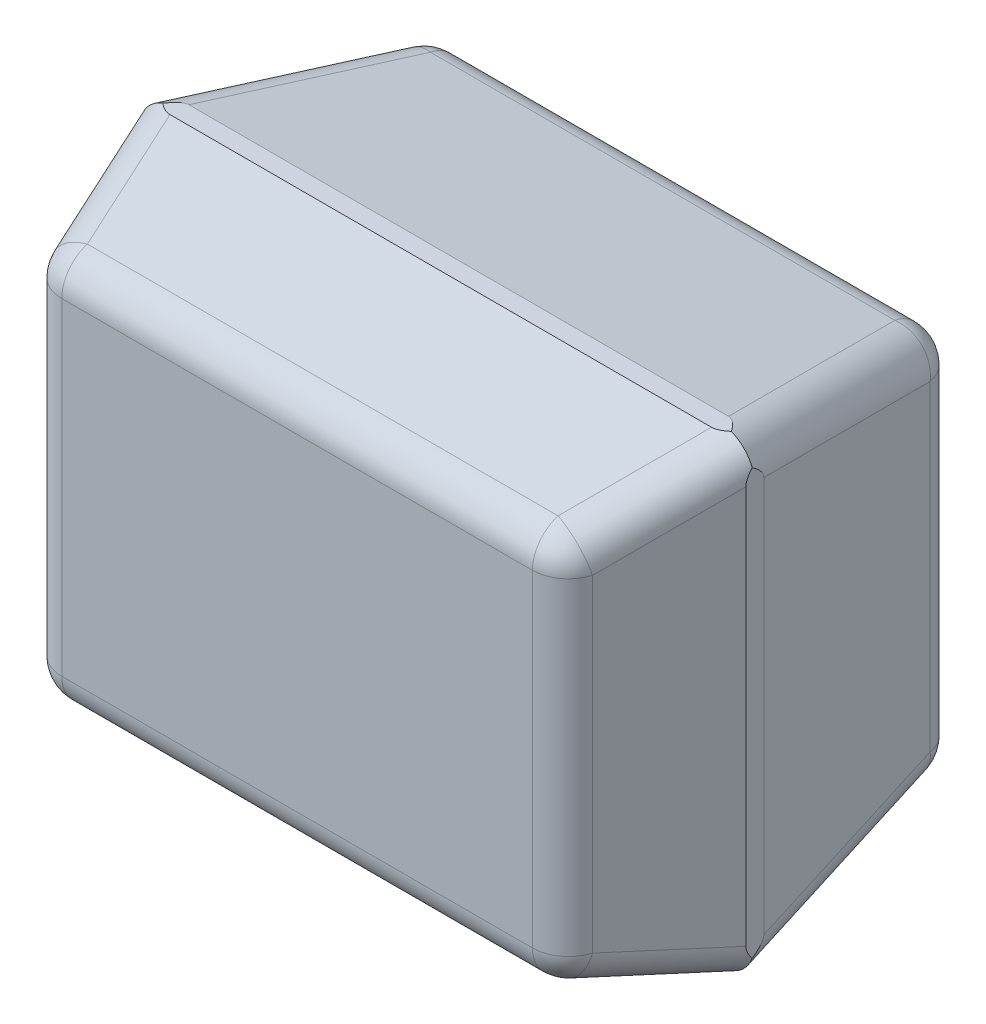
ISO-10303-21;
HEADER;
FILE_DESCRIPTION(('STEP AP214'),'2;1');
FILE_NAME('part.step','',(''),(''),'','','');
FILE_SCHEMA(('AUTOMOTIVE_DESIGN { 1 0 10303 214 1 1 1 1 }'));
ENDSEC;
DATA;
#1=APPLICATION_CONTEXT('core data for automotive mechanical design processes');
#2=APPLICATION_PROTOCOL_DEFINITION('international standard','automotive_design',2000,#1);
#3=PRODUCT_CONTEXT('',#1,'mechanical');
#4=PRODUCT('Part','Part','',(#3));
#5=PRODUCT_RELATED_PRODUCT_CATEGORY('part','',(#4));
#6=PRODUCT_DEFINITION_FORMATION('','',#4);
#7=PRODUCT_DEFINITION_CONTEXT('part definition',#1,'design');
#8=PRODUCT_DEFINITION('design','',#6,#7);
#9=PRODUCT_DEFINITION_SHAPE('','',#8);
#10=(LENGTH_UNIT() NAMED_UNIT(*) SI_UNIT(.MILLI.,.METRE.));
#11=(NAMED_UNIT(*) PLANE_ANGLE_UNIT() SI_UNIT($,.RADIAN.));
#12=(NAMED_UNIT(*) SI_UNIT($,.STERADIAN.) SOLID_ANGLE_UNIT());
#13=UNCERTAINTY_MEASURE_WITH_UNIT(LENGTH_MEASURE(1.E-05),#10,'distance_accuracy_value','');
#14=(GEOMETRIC_REPRESENTATION_CONTEXT(3) GLOBAL_UNCERTAINTY_ASSIGNED_CONTEXT((#13)) GLOBAL_UNIT_ASSIGNED_CONTEXT((#10,
#11,#12)) REPRESENTATION_CONTEXT('',''));
#15=CARTESIAN_POINT('',(0.,0.,0.));
#16=DIRECTION('',(0.,0.,1.));
#17=DIRECTION('',(1.,0.,0.));
#18=AXIS2_PLACEMENT_3D('',#15,#16,#17);
#19=CARTESIAN_POINT('',(0.85,-0.65,0.));
#20=DIRECTION('',(1.,0.,0.));
#21=DIRECTION('',(0.,1.,0.));
#22=AXIS2_PLACEMENT_3D('',#19,#20,#21);
#23=PLANE('',#22);
#24=CARTESIAN_POINT('',(0.85,0.65,1.200820095655));
#25=DIRECTION('',(-1.,0.,0.));
#26=DIRECTION('',(0.,-0.181547479456044,-0.983382180387238));
#27=AXIS2_PLACEMENT_3D('',#24,#25,#26);
#28=ELLIPSE('',#27,0.559823881036,0.1);
#29=CARTESIAN_POINT('',(0.85,0.591767771434,0.682368669292));
#30=VERTEX_POINT('',#29);
#31=CARTESIAN_POINT('',(0.85,0.551661781961,0.65));
#32=VERTEX_POINT('',#31);
#33=EDGE_CURVE('E279',#30,#32,#28,.T.);
#34=ORIENTED_EDGE('',*,*,#33,.F.);
#35=CARTESIAN_POINT('',(0.85,0.65,0.351989783036));
#36=DIRECTION('',(-1.,0.,0.));
#37=DIRECTION('',(0.,-0.28734788556607,0.957826285221234));
#38=AXIS2_PLACEMENT_3D('',#35,#36,#37);
#39=ELLIPSE('',#38,0.36209268304,0.1);
#40=CARTESIAN_POINT('',(0.85,0.554217371478,0.7));
#41=VERTEX_POINT('',#40);
#42=EDGE_CURVE('E395',#41,#30,#39,.T.);
#43=ORIENTED_EDGE('',*,*,#42,.F.);
#44=DIRECTION('',(0.,1.,0.));
#45=VECTOR('',#44,1.);
#46=CARTESIAN_POINT('',(0.85,-0.325,0.7));
#47=LINE('',#46,#45);
#48=CARTESIAN_POINT('',(0.85,-0.554217371478,0.7));
#49=VERTEX_POINT('',#48);
#50=EDGE_CURVE('E11',#49,#41,#47,.T.);
#51=ORIENTED_EDGE('',*,*,#50,.F.);
#52=CARTESIAN_POINT('',(0.85,-0.65,0.351989783036));
#53=DIRECTION('',(-1.,0.,0.));
#54=DIRECTION('',(0.,0.28734788556607,0.957826285221234));
#55=AXIS2_PLACEMENT_3D('',#52,#53,#54);
#56=ELLIPSE('',#55,0.36209268304,0.1);
#57=CARTESIAN_POINT('',(0.85,-0.591767771434,0.682368669292));
#58=VERTEX_POINT('',#57);
#59=EDGE_CURVE('E465',#58,#49,#56,.T.);
#60=ORIENTED_EDGE('',*,*,#59,.F.);
#61=CARTESIAN_POINT('',(0.85,-0.65,1.200820095655));
#62=DIRECTION('',(-1.,0.,0.));
#63=DIRECTION('',(0.,0.181547479456044,-0.983382180387238));
#64=AXIS2_PLACEMENT_3D('',#61,#62,#63);
#65=ELLIPSE('',#64,0.559823881036,0.1);
#66=CARTESIAN_POINT('',(0.85,-0.551661781961,0.65));
#67=VERTEX_POINT('',#66);
#68=EDGE_CURVE('E365',#67,#58,#65,.T.);
#69=ORIENTED_EDGE('',*,*,#68,.F.);
#70=DIRECTION('',(0.,-1.,0.));
#71=VECTOR('',#70,1.);
#72=CARTESIAN_POINT('',(0.85,-0.325,0.65));
#73=LINE('',#72,#71);
#74=EDGE_CURVE('E27',#32,#67,#73,.T.);
#75=ORIENTED_EDGE('',*,*,#74,.F.);
#76=EDGE_LOOP('',(#34,#43,#51,#60,#69,#75));
#77=FACE_BOUND('',#76,.T.);
#78=ADVANCED_FACE('F16',(#77),#23,.T.);
#79=CARTESIAN_POINT('',(0.425,0.59,0.9));
#80=DIRECTION('',(0.,0.957826285221234,0.28734788556607));
#81=DIRECTION('',(1.,0.,0.));
#82=AXIS2_PLACEMENT_3D('',#79,#80,#81);
#83=PLANE('',#82);
#84=DIRECTION('',(-0.276172385369158,-0.276172385369158,0.920574617898527));
#85=VECTOR('',#84,1.);
#86=CARTESIAN_POINT('',(0.652709266874,0.548491895396,1.038360348681));
#87=LINE('',#86,#85);
#88=CARTESIAN_POINT('',(0.754217371478,0.65,0.7));
#89=VERTEX_POINT('',#88);
#90=CARTESIAN_POINT('',(0.655596934911,0.551379563433,1.028734788557));
#91=VERTEX_POINT('',#90);
#92=EDGE_CURVE('E300',#89,#91,#87,.T.);
#93=ORIENTED_EDGE('',*,*,#92,.F.);
#94=DIRECTION('',(-1.,0.,0.));
#95=VECTOR('',#94,1.);
#96=CARTESIAN_POINT('',(0.425,0.65,0.7));
#97=LINE('',#96,#95);
#98=CARTESIAN_POINT('',(-0.754217371478,0.65,0.7));
#99=VERTEX_POINT('',#98);
#100=EDGE_CURVE('E328',#89,#99,#97,.T.);
#101=ORIENTED_EDGE('',*,*,#100,.T.);
#102=DIRECTION('',(-0.276172385369158,0.276172385369158,-0.920574617898527));
#103=VECTOR('',#102,1.);
#104=CARTESIAN_POINT('',(-0.64508214823,0.540864776752,1.063784077494));
#105=LINE('',#104,#103);
#106=CARTESIAN_POINT('',(-0.655596934911,0.551379563433,1.028734788557));
#107=VERTEX_POINT('',#106);
#108=EDGE_CURVE('E400',#107,#99,#105,.T.);
#109=ORIENTED_EDGE('',*,*,#108,.F.);
#110=DIRECTION('',(-1.,0.,0.));
#111=VECTOR('',#110,1.);
#112=CARTESIAN_POINT('',(0.2125,0.551379563433,1.028734788557));
#113=LINE('',#112,#111);
#114=EDGE_CURVE('E285',#91,#107,#113,.T.);
#115=ORIENTED_EDGE('',*,*,#114,.F.);
#116=EDGE_LOOP('',(#93,#101,#109,#115));
#117=FACE_BOUND('',#116,.T.);
#118=ADVANCED_FACE('F871',(#117),#83,.T.);
#119=CARTESIAN_POINT('',(0.79,-0.325,0.9));
#120=DIRECTION('',(0.957826285221234,0.,0.28734788556607));
#121=DIRECTION('',(0.,-1.,0.));
#122=AXIS2_PLACEMENT_3D('',#119,#120,#121);
#123=PLANE('',#122);
#124=DIRECTION('',(-0.276172385369158,0.276172385369158,0.920574617898527));
#125=VECTOR('',#124,1.);
#126=CARTESIAN_POINT('',(0.740864776752,-0.44508214823,1.063784077494));
#127=LINE('',#126,#125);
#128=CARTESIAN_POINT('',(0.751379563433,-0.455596934911,1.028734788557));
#129=VERTEX_POINT('',#128);
#130=EDGE_CURVE('E460',#49,#129,#127,.T.);
#131=ORIENTED_EDGE('',*,*,#130,.F.);
#132=ORIENTED_EDGE('',*,*,#50,.T.);
#133=DIRECTION('',(0.276172385369158,0.276172385369158,-0.920574617898527));
#134=VECTOR('',#133,1.);
#135=CARTESIAN_POINT('',(0.748491895396,0.452709266874,1.038360348681));
#136=LINE('',#135,#134);
#137=CARTESIAN_POINT('',(0.751379563433,0.455596934911,1.028734788557));
#138=VERTEX_POINT('',#137);
#139=EDGE_CURVE('E356',#138,#41,#136,.T.);
#140=ORIENTED_EDGE('',*,*,#139,.F.);
#141=DIRECTION('',(0.,1.,0.));
#142=VECTOR('',#141,1.);
#143=CARTESIAN_POINT('',(0.751379563433,-0.1625,1.028734788557));
#144=LINE('',#143,#142);
#145=EDGE_CURVE('E313',#129,#138,#144,.T.);
#146=ORIENTED_EDGE('',*,*,#145,.F.);
#147=EDGE_LOOP('',(#131,#132,#140,#146));
#148=FACE_BOUND('',#147,.T.);
#149=ADVANCED_FACE('F876',(#148),#123,.T.);
#150=CARTESIAN_POINT('',(0.79,-0.325,0.325));
#151=DIRECTION('',(0.983382180387238,0.,-0.181547479456044));
#152=DIRECTION('',(0.,-1.,0.));
#153=AXIS2_PLACEMENT_3D('',#150,#151,#152);
#154=PLANE('',#153);
#155=DIRECTION('',(-0.178627606623071,-0.178627606623071,-0.967566202543385));
#156=VECTOR('',#155,1.);
#157=CARTESIAN_POINT('',(0.772716752359,0.474378534321,0.231382408613));
#158=LINE('',#157,#156);
#159=CARTESIAN_POINT('',(0.745109892687,0.446771674648,0.08184525205439));
#160=VERTEX_POINT('',#159);
#161=EDGE_CURVE('E248',#32,#160,#158,.T.);
#162=ORIENTED_EDGE('',*,*,#161,.F.);
#163=ORIENTED_EDGE('',*,*,#74,.T.);
#164=DIRECTION('',(0.178627606623071,-0.178627606623071,0.967566202543385));
#165=VECTOR('',#164,1.);
#166=CARTESIAN_POINT('',(0.769525970175,-0.471187752136,0.214099005112));
#167=LINE('',#166,#165);
#168=CARTESIAN_POINT('',(0.745109892687,-0.446771674648,0.08184525205439));
#169=VERTEX_POINT('',#168);
#170=EDGE_CURVE('E361',#169,#67,#167,.T.);
#171=ORIENTED_EDGE('',*,*,#170,.F.);
#172=DIRECTION('',(0.,-1.,0.));
#173=VECTOR('',#172,1.);
#174=CARTESIAN_POINT('',(0.745109892687,-0.1625,0.08184525205439));
#175=LINE('',#174,#173);
#176=EDGE_CURVE('E335',#160,#169,#175,.T.);
#177=ORIENTED_EDGE('',*,*,#176,.F.);
#178=EDGE_LOOP('',(#162,#163,#171,#177));
#179=FACE_BOUND('',#178,.T.);
#180=ADVANCED_FACE('F606',(#179),#154,.T.);
#181=CARTESIAN_POINT('',(0.,0.,1.1));
#182=DIRECTION('',(0.,0.,1.));
#183=DIRECTION('',(1.,0.,0.));
#184=AXIS2_PLACEMENT_3D('',#181,#182,#183);
#185=PLANE('',#184);
#186=DIRECTION('',(1.,0.,0.));
#187=VECTOR('',#186,1.);
#188=CARTESIAN_POINT('',(0.2125,0.455596934911,1.1));
#189=LINE('',#188,#187);
#190=CARTESIAN_POINT('',(-0.655596934911,0.455596934911,1.1));
#191=VERTEX_POINT('',#190);
#192=CARTESIAN_POINT('',(0.655596934911,0.455596934911,1.1));
#193=VERTEX_POINT('',#192);
#194=EDGE_CURVE('E280',#191,#193,#189,.T.);
#195=ORIENTED_EDGE('',*,*,#194,.F.);
#196=DIRECTION('',(0.,1.,0.));
#197=VECTOR('',#196,1.);
#198=CARTESIAN_POINT('',(-0.655596934911,0.1625,1.1));
#199=LINE('',#198,#197);
#200=CARTESIAN_POINT('',(-0.655596934911,-0.455596934911,1.1));
#201=VERTEX_POINT('',#200);
#202=EDGE_CURVE('E309',#201,#191,#199,.T.);
#203=ORIENTED_EDGE('',*,*,#202,.F.);
#204=DIRECTION('',(-1.,0.,0.));
#205=VECTOR('',#204,1.);
#206=CARTESIAN_POINT('',(-0.2125,-0.455596934911,1.1));
#207=LINE('',#206,#205);
#208=CARTESIAN_POINT('',(0.655596934911,-0.455596934911,1.1));
#209=VERTEX_POINT('',#208);
#210=EDGE_CURVE('E473',#209,#201,#207,.T.);
#211=ORIENTED_EDGE('',*,*,#210,.F.);
#212=DIRECTION('',(0.,-1.,0.));
#213=VECTOR('',#212,1.);
#214=CARTESIAN_POINT('',(0.655596934911,-0.1625,1.1));
#215=LINE('',#214,#213);
#216=EDGE_CURVE('E311',#193,#209,#215,.T.);
#217=ORIENTED_EDGE('',*,*,#216,.F.);
#218=EDGE_LOOP('',(#195,#203,#211,#217));
#219=FACE_BOUND('',#218,.T.);
#220=ADVANCED_FACE('F839',(#219),#185,.T.);
#221=CARTESIAN_POINT('',(-0.79,0.325,0.9));
#222=DIRECTION('',(-0.957826285221234,0.,0.28734788556607));
#223=DIRECTION('',(0.,1.,0.));
#224=AXIS2_PLACEMENT_3D('',#221,#222,#223);
#225=PLANE('',#224);
#226=DIRECTION('',(-0.276172385369158,-0.276172385369158,-0.920574617898527));
#227=VECTOR('',#226,1.);
#228=CARTESIAN_POINT('',(-0.748491895396,-0.452709266874,1.038360348681));
#229=LINE('',#228,#227);
#230=CARTESIAN_POINT('',(-0.751379563433,-0.455596934911,1.028734788557));
#231=VERTEX_POINT('',#230);
#232=CARTESIAN_POINT('',(-0.85,-0.554217371478,0.7));
#233=VERTEX_POINT('',#232);
#234=EDGE_CURVE('E343',#231,#233,#229,.T.);
#235=ORIENTED_EDGE('',*,*,#234,.F.);
#236=DIRECTION('',(0.,-1.,0.));
#237=VECTOR('',#236,1.);
#238=CARTESIAN_POINT('',(-0.751379563433,0.1625,1.028734788557));
#239=LINE('',#238,#237);
#240=CARTESIAN_POINT('',(-0.751379563433,0.455596934911,1.028734788557));
#241=VERTEX_POINT('',#240);
#242=EDGE_CURVE('E305',#241,#231,#239,.T.);
#243=ORIENTED_EDGE('',*,*,#242,.F.);
#244=DIRECTION('',(0.276172385369158,-0.276172385369158,0.920574617898527));
#245=VECTOR('',#244,1.);
#246=CARTESIAN_POINT('',(-0.740864776752,0.44508214823,1.063784077494));
#247=LINE('',#246,#245);
#248=CARTESIAN_POINT('',(-0.85,0.554217371478,0.7));
#249=VERTEX_POINT('',#248);
#250=EDGE_CURVE('E333',#249,#241,#247,.T.);
#251=ORIENTED_EDGE('',*,*,#250,.F.);
#252=DIRECTION('',(0.,-1.,0.));
#253=VECTOR('',#252,1.);
#254=CARTESIAN_POINT('',(-0.85,0.325,0.7));
#255=LINE('',#254,#253);
#256=EDGE_CURVE('E490',#249,#233,#255,.T.);
#257=ORIENTED_EDGE('',*,*,#256,.T.);
#258=EDGE_LOOP('',(#235,#243,#251,#257));
#259=FACE_BOUND('',#258,.T.);
#260=ADVANCED_FACE('F572',(#259),#225,.T.);
#261=CARTESIAN_POINT('',(-0.425,-0.59,0.325));
#262=DIRECTION('',(0.,-0.983382180387238,-0.181547479456044));
#263=DIRECTION('',(0.,0.181547479456044,-0.983382180387238));
#264=AXIS2_PLACEMENT_3D('',#261,#262,#263);
#265=PLANE('',#264);
#266=DIRECTION('',(-0.178627606623071,0.178627606623071,-0.967566202543385));
#267=VECTOR('',#266,1.);
#268=CARTESIAN_POINT('',(0.671187752136,-0.569525970175,0.214099005112));
#269=LINE('',#268,#267);
#270=CARTESIAN_POINT('',(0.751661781961,-0.65,0.65));
#271=VERTEX_POINT('',#270);
#272=CARTESIAN_POINT('',(0.646771674648,-0.545109892687,0.08184525205439));
#273=VERTEX_POINT('',#272);
#274=EDGE_CURVE('E366',#271,#273,#269,.T.);
#275=ORIENTED_EDGE('',*,*,#274,.F.);
#276=DIRECTION('',(-1.,0.,0.));
#277=VECTOR('',#276,1.);
#278=CARTESIAN_POINT('',(-0.425,-0.65,0.65));
#279=LINE('',#278,#277);
#280=CARTESIAN_POINT('',(-0.751661781961,-0.65,0.65));
#281=VERTEX_POINT('',#280);
#282=EDGE_CURVE('E442',#271,#281,#279,.T.);
#283=ORIENTED_EDGE('',*,*,#282,.T.);
#284=DIRECTION('',(-0.178627606623071,-0.178627606623071,0.967566202543385));
#285=VECTOR('',#284,1.);
#286=CARTESIAN_POINT('',(-0.674378534321,-0.572716752359,0.231382408613));
#287=LINE('',#286,#285);
#288=CARTESIAN_POINT('',(-0.646771674648,-0.545109892687,0.08184525205439));
#289=VERTEX_POINT('',#288);
#290=EDGE_CURVE('E291',#289,#281,#287,.T.);
#291=ORIENTED_EDGE('',*,*,#290,.F.);
#292=DIRECTION('',(-1.,0.,0.));
#293=VECTOR('',#292,1.);
#294=CARTESIAN_POINT('',(-0.2125,-0.545109892687,0.08184525205439));
#295=LINE('',#294,#293);
#296=EDGE_CURVE('E315',#273,#289,#295,.T.);
#297=ORIENTED_EDGE('',*,*,#296,.F.);
#298=EDGE_LOOP('',(#275,#283,#291,#297));
#299=FACE_BOUND('',#298,.T.);
#300=ADVANCED_FACE('F815',(#299),#265,.T.);
#301=CARTESIAN_POINT('',(-0.85,-0.65,0.));
#302=DIRECTION('',(0.,-1.,0.));
#303=DIRECTION('',(0.,0.,-1.));
#304=AXIS2_PLACEMENT_3D('',#301,#302,#303);
#305=PLANE('',#304);
#306=CARTESIAN_POINT('',(0.85,-0.65,1.200820095655));
#307=DIRECTION('',(0.,1.,0.));
#308=DIRECTION('',(-0.181547479456044,0.,-0.983382180387238));
#309=AXIS2_PLACEMENT_3D('',#306,#307,#308);
#310=ELLIPSE('',#309,0.559823881036,0.1);
#311=CARTESIAN_POINT('',(0.791767771434,-0.65,0.682368669292));
#312=VERTEX_POINT('',#311);
#313=EDGE_CURVE('E391',#312,#271,#310,.T.);
#314=ORIENTED_EDGE('',*,*,#313,.F.);
#315=CARTESIAN_POINT('',(0.85,-0.65,0.351989783036));
#316=DIRECTION('',(0.,1.,0.));
#317=DIRECTION('',(-0.28734788556607,0.,0.957826285221234));
#318=AXIS2_PLACEMENT_3D('',#315,#316,#317);
#319=ELLIPSE('',#318,0.36209268304,0.1);
#320=CARTESIAN_POINT('',(0.754217371478,-0.65,0.7));
#321=VERTEX_POINT('',#320);
#322=EDGE_CURVE('E439',#321,#312,#319,.T.);
#323=ORIENTED_EDGE('',*,*,#322,.F.);
#324=DIRECTION('',(1.,0.,0.));
#325=VECTOR('',#324,1.);
#326=CARTESIAN_POINT('',(-0.425,-0.65,0.7));
#327=LINE('',#326,#325);
#328=CARTESIAN_POINT('',(-0.754217371478,-0.65,0.7));
#329=VERTEX_POINT('',#328);
#330=EDGE_CURVE('E41',#329,#321,#327,.T.);
#331=ORIENTED_EDGE('',*,*,#330,.F.);
#332=CARTESIAN_POINT('',(-0.85,-0.65,0.351989783036));
#333=DIRECTION('',(0.,1.,0.));
#334=DIRECTION('',(0.28734788556607,0.,0.957826285221234));
#335=AXIS2_PLACEMENT_3D('',#332,#333,#334);
#336=ELLIPSE('',#335,0.36209268304,0.1);
#337=CARTESIAN_POINT('',(-0.791767771434,-0.65,0.682368669292));
#338=VERTEX_POINT('',#337);
#339=EDGE_CURVE('E494',#338,#329,#336,.T.);
#340=ORIENTED_EDGE('',*,*,#339,.F.);
#341=CARTESIAN_POINT('',(-0.85,-0.65,1.200820095655));
#342=DIRECTION('',(0.,1.,0.));
#343=DIRECTION('',(0.181547479456044,0.,-0.983382180387238));
#344=AXIS2_PLACEMENT_3D('',#341,#342,#343);
#345=ELLIPSE('',#344,0.559823881036,0.1);
#346=EDGE_CURVE('E286',#281,#338,#345,.T.);
#347=ORIENTED_EDGE('',*,*,#346,.F.);
#348=ORIENTED_EDGE('',*,*,#282,.F.);
#349=EDGE_LOOP('',(#314,#323,#331,#340,#347,#348));
#350=FACE_BOUND('',#349,.T.);
#351=ADVANCED_FACE('F820',(#350),#305,.T.);
#352=CARTESIAN_POINT('',(-0.425,-0.59,0.9));
#353=DIRECTION('',(0.,-0.957826285221234,0.28734788556607));
#354=DIRECTION('',(-1.,0.,0.));
#355=AXIS2_PLACEMENT_3D('',#352,#353,#354);
#356=PLANE('',#355);
#357=DIRECTION('',(0.276172385369158,-0.276172385369158,-0.920574617898527));
#358=VECTOR('',#357,1.);
#359=CARTESIAN_POINT('',(0.64508214823,-0.540864776752,1.063784077494));
#360=LINE('',#359,#358);
#361=CARTESIAN_POINT('',(0.655596934911,-0.551379563433,1.028734788557));
#362=VERTEX_POINT('',#361);
#363=EDGE_CURVE('E464',#362,#321,#360,.T.);
#364=ORIENTED_EDGE('',*,*,#363,.F.);
#365=DIRECTION('',(1.,0.,0.));
#366=VECTOR('',#365,1.);
#367=CARTESIAN_POINT('',(-0.2125,-0.551379563433,1.028734788557));
#368=LINE('',#367,#366);
#369=CARTESIAN_POINT('',(-0.655596934911,-0.551379563433,1.028734788557));
#370=VERTEX_POINT('',#369);
#371=EDGE_CURVE('E378',#370,#362,#368,.T.);
#372=ORIENTED_EDGE('',*,*,#371,.F.);
#373=DIRECTION('',(0.276172385369158,0.276172385369158,0.920574617898527));
#374=VECTOR('',#373,1.);
#375=CARTESIAN_POINT('',(-0.652709266874,-0.548491895396,1.038360348681));
#376=LINE('',#375,#374);
#377=EDGE_CURVE('E448',#329,#370,#376,.T.);
#378=ORIENTED_EDGE('',*,*,#377,.F.);
#379=ORIENTED_EDGE('',*,*,#330,.T.);
#380=EDGE_LOOP('',(#364,#372,#378,#379));
#381=FACE_BOUND('',#380,.T.);
#382=ADVANCED_FACE('F552',(#381),#356,.T.);
#383=CARTESIAN_POINT('',(0.655596934911,-0.1625,1.));
#384=DIRECTION('',(0.,-1.,0.));
#385=DIRECTION('',(0.596930529640349,0.,0.80229292828947));
#386=AXIS2_PLACEMENT_3D('',#383,#384,#385);
#387=CYLINDRICAL_SURFACE('',#386,0.1);
#388=CARTESIAN_POINT('',(0.655596934911,-0.455596934911,1.));
#389=DIRECTION('',(0.,-1.,0.));
#390=DIRECTION('',(0.,0.,1.));
#391=AXIS2_PLACEMENT_3D('',#388,#389,#390);
#392=CIRCLE('',#391,0.1);
#393=EDGE_CURVE('E348',#129,#209,#392,.T.);
#394=ORIENTED_EDGE('',*,*,#393,.F.);
#395=ORIENTED_EDGE('',*,*,#145,.T.);
#396=CARTESIAN_POINT('',(0.655596934911,0.455596934911,1.));
#397=DIRECTION('',(0.,1.,0.));
#398=DIRECTION('',(0.957826285221234,0.,0.28734788556607));
#399=AXIS2_PLACEMENT_3D('',#396,#397,#398);
#400=CIRCLE('',#399,0.1);
#401=EDGE_CURVE('E344',#193,#138,#400,.T.);
#402=ORIENTED_EDGE('',*,*,#401,.F.);
#403=ORIENTED_EDGE('',*,*,#216,.T.);
#404=EDGE_LOOP('',(#394,#395,#402,#403));
#405=FACE_BOUND('',#404,.T.);
#406=ADVANCED_FACE('F917',(#405),#387,.T.);
#407=CARTESIAN_POINT('',(0.64508214823,-0.44508214823,1.035049288938));
#408=DIRECTION('',(0.276172385369258,-0.276172385369258,-0.920574617898467));
#409=DIRECTION('',(0.650944554904221,-0.650944554904221,0.390566732942133));
#410=AXIS2_PLACEMENT_3D('',#407,#408,#409);
#411=CYLINDRICAL_SURFACE('',#410,0.1);
#412=CARTESIAN_POINT('',(0.752990821415,-0.552990821415,0.675353711653));
#413=DIRECTION('',(0.0515244805270818,-0.0515244805270818,-0.997341694612648));
#414=DIRECTION('',(0.705227075420686,-0.705227075420686,0.0728666191556276));
#415=AXIS2_PLACEMENT_3D('',#412,#413,#414);
#416=ELLIPSE('',#415,0.105642723659,0.1);
#417=EDGE_CURVE('E320',#58,#312,#416,.T.);
#418=ORIENTED_EDGE('',*,*,#417,.F.);
#419=ORIENTED_EDGE('',*,*,#59,.T.);
#420=ORIENTED_EDGE('',*,*,#130,.T.);
#421=CARTESIAN_POINT('',(0.655596934911,-0.455596934911,1.));
#422=DIRECTION('',(-0.276172385369261,0.276172385369158,0.920574617898496));
#423=DIRECTION('',(0.957826285221234,0.,0.28734788556607));
#424=AXIS2_PLACEMENT_3D('',#421,#422,#423);
#425=CIRCLE('',#424,0.1);
#426=EDGE_CURVE('E360',#362,#129,#425,.T.);
#427=ORIENTED_EDGE('',*,*,#426,.F.);
#428=ORIENTED_EDGE('',*,*,#363,.T.);
#429=ORIENTED_EDGE('',*,*,#322,.T.);
#430=EDGE_LOOP('',(#418,#419,#420,#427,#428,#429));
#431=FACE_BOUND('',#430,.T.);
#432=ADVANCED_FACE('F922',(#431),#411,.T.);
#433=CARTESIAN_POINT('',(-0.2125,-0.455596934911,1.));
#434=DIRECTION('',(-1.,0.,0.));
#435=DIRECTION('',(0.,-0.596930529640349,0.80229292828947));
#436=AXIS2_PLACEMENT_3D('',#433,#434,#435);
#437=CYLINDRICAL_SURFACE('',#436,0.1);
#438=CARTESIAN_POINT('',(-0.655596934911,-0.455596934911,1.));
#439=DIRECTION('',(-1.,0.,0.));
#440=DIRECTION('',(0.,0.,1.));
#441=AXIS2_PLACEMENT_3D('',#438,#439,#440);
#442=CIRCLE('',#441,0.1);
#443=EDGE_CURVE('E284',#370,#201,#442,.T.);
#444=ORIENTED_EDGE('',*,*,#443,.F.);
#445=ORIENTED_EDGE('',*,*,#371,.T.);
#446=CARTESIAN_POINT('',(0.655596934911,-0.455596934911,1.));
#447=DIRECTION('',(1.,0.,0.));
#448=DIRECTION('',(0.,-0.957826285221234,0.28734788556607));
#449=AXIS2_PLACEMENT_3D('',#446,#447,#448);
#450=CIRCLE('',#449,0.1);
#451=EDGE_CURVE('E352',#209,#362,#450,.T.);
#452=ORIENTED_EDGE('',*,*,#451,.F.);
#453=ORIENTED_EDGE('',*,*,#210,.T.);
#454=EDGE_LOOP('',(#444,#445,#452,#453));
#455=FACE_BOUND('',#454,.T.);
#456=ADVANCED_FACE('F560',(#455),#437,.T.);
#457=CARTESIAN_POINT('',(0.655596934911,-0.455596934911,1.));
#458=DIRECTION('',(-0.23963638661294,-0.887334426432776,-0.393969564659901));
#459=DIRECTION('',(0.461126463854962,-0.461126463854962,0.758106040514938));
#460=AXIS2_PLACEMENT_3D('',#457,#458,#459);
#461=SPHERICAL_SURFACE('',#460,0.1);
#462=ORIENTED_EDGE('',*,*,#393,.T.);
#463=ORIENTED_EDGE('',*,*,#451,.T.);
#464=ORIENTED_EDGE('',*,*,#426,.T.);
#465=EDGE_LOOP('',(#462,#463,#464));
#466=FACE_BOUND('',#465,.T.);
#467=ADVANCED_FACE('F933',(#466),#461,.T.);
#468=CARTESIAN_POINT('',(-0.655596934911,0.1625,1.));
#469=DIRECTION('',(0.,1.,0.));
#470=DIRECTION('',(-0.596930529640349,0.,0.80229292828947));
#471=AXIS2_PLACEMENT_3D('',#468,#469,#470);
#472=CYLINDRICAL_SURFACE('',#471,0.1);
#473=CARTESIAN_POINT('',(-0.655596934911,0.455596934911,1.));
#474=DIRECTION('',(0.,1.,0.));
#475=DIRECTION('',(0.,0.,1.));
#476=AXIS2_PLACEMENT_3D('',#473,#474,#475);
#477=CIRCLE('',#476,0.1);
#478=EDGE_CURVE('E338',#241,#191,#477,.T.);
#479=ORIENTED_EDGE('',*,*,#478,.F.);
#480=ORIENTED_EDGE('',*,*,#242,.T.);
#481=CARTESIAN_POINT('',(-0.655596934911,-0.455596934911,1.));
#482=DIRECTION('',(0.,-1.,0.));
#483=DIRECTION('',(-0.957826285221234,0.,0.28734788556607));
#484=AXIS2_PLACEMENT_3D('',#481,#482,#483);
#485=CIRCLE('',#484,0.1);
#486=EDGE_CURVE('E310',#201,#231,#485,.T.);
#487=ORIENTED_EDGE('',*,*,#486,.F.);
#488=ORIENTED_EDGE('',*,*,#202,.T.);
#489=EDGE_LOOP('',(#479,#480,#487,#488));
#490=FACE_BOUND('',#489,.T.);
#491=ADVANCED_FACE('F975',(#490),#472,.T.);
#492=CARTESIAN_POINT('',(-0.655596934911,-0.455596934911,1.));
#493=DIRECTION('',(0.23963638661294,-0.887334426432776,-0.393969564659901));
#494=DIRECTION('',(-0.461126463854962,-0.461126463854962,0.758106040514938));
#495=AXIS2_PLACEMENT_3D('',#492,#493,#494);
#496=SPHERICAL_SURFACE('',#495,0.1);
#497=ORIENTED_EDGE('',*,*,#443,.T.);
#498=ORIENTED_EDGE('',*,*,#486,.T.);
#499=CARTESIAN_POINT('',(-0.655596934911,-0.455596934911,1.));
#500=DIRECTION('',(0.276172385369158,0.276172385369261,0.920574617898496));
#501=DIRECTION('',(0.,-0.957826285221234,0.28734788556607));
#502=AXIS2_PLACEMENT_3D('',#499,#500,#501);
#503=CIRCLE('',#502,0.1);
#504=EDGE_CURVE('E445',#231,#370,#503,.T.);
#505=ORIENTED_EDGE('',*,*,#504,.T.);
#506=EDGE_LOOP('',(#497,#498,#505));
#507=FACE_BOUND('',#506,.T.);
#508=ADVANCED_FACE('F565',(#507),#496,.T.);
#509=CARTESIAN_POINT('',(0.2125,0.455596934911,1.));
#510=DIRECTION('',(1.,0.,0.));
#511=DIRECTION('',(0.,0.596930529640349,0.80229292828947));
#512=AXIS2_PLACEMENT_3D('',#509,#510,#511);
#513=CYLINDRICAL_SURFACE('',#512,0.1);
#514=CARTESIAN_POINT('',(0.655596934911,0.455596934911,1.));
#515=DIRECTION('',(1.,0.,0.));
#516=DIRECTION('',(0.,0.,1.));
#517=AXIS2_PLACEMENT_3D('',#514,#515,#516);
#518=CIRCLE('',#517,0.1);
#519=EDGE_CURVE('E296',#91,#193,#518,.T.);
#520=ORIENTED_EDGE('',*,*,#519,.F.);
#521=ORIENTED_EDGE('',*,*,#114,.T.);
#522=CARTESIAN_POINT('',(-0.655596934911,0.455596934911,1.));
#523=DIRECTION('',(-1.,0.,0.));
#524=DIRECTION('',(0.,0.957826285221234,0.28734788556607));
#525=AXIS2_PLACEMENT_3D('',#522,#523,#524);
#526=CIRCLE('',#525,0.1);
#527=EDGE_CURVE('E342',#191,#107,#526,.T.);
#528=ORIENTED_EDGE('',*,*,#527,.F.);
#529=ORIENTED_EDGE('',*,*,#194,.T.);
#530=EDGE_LOOP('',(#520,#521,#528,#529));
#531=FACE_BOUND('',#530,.T.);
#532=ADVANCED_FACE('F803',(#531),#513,.T.);
#533=CARTESIAN_POINT('',(0.652709266874,0.452709266874,1.009625560124));
#534=DIRECTION('',(-0.276172385369258,-0.276172385369258,0.920574617898467));
#535=DIRECTION('',(0.650944554904221,0.650944554904221,0.390566732942133));
#536=AXIS2_PLACEMENT_3D('',#533,#534,#535);
#537=CYLINDRICAL_SURFACE('',#536,0.1);
#538=CARTESIAN_POINT('',(0.752990821415,0.552990821415,0.675353711653));
#539=DIRECTION('',(0.0515244805270818,0.0515244805270818,-0.997341694612648));
#540=DIRECTION('',(0.705227075420686,0.705227075420686,0.0728666191556276));
#541=AXIS2_PLACEMENT_3D('',#538,#539,#540);
#542=ELLIPSE('',#541,0.105642723659,0.1);
#543=CARTESIAN_POINT('',(0.791767771434,0.65,0.682368669292));
#544=VERTEX_POINT('',#543);
#545=EDGE_CURVE('E274',#544,#30,#542,.T.);
#546=ORIENTED_EDGE('',*,*,#545,.F.);
#547=CARTESIAN_POINT('',(0.85,0.65,0.351989783036));
#548=DIRECTION('',(0.,-1.,0.));
#549=DIRECTION('',(-0.28734788556607,0.,0.957826285221234));
#550=AXIS2_PLACEMENT_3D('',#547,#548,#549);
#551=ELLIPSE('',#550,0.36209268304,0.1);
#552=EDGE_CURVE('E334',#544,#89,#551,.T.);
#553=ORIENTED_EDGE('',*,*,#552,.T.);
#554=ORIENTED_EDGE('',*,*,#92,.T.);
#555=CARTESIAN_POINT('',(0.655596934911,0.455596934911,1.));
#556=DIRECTION('',(-0.276172385369158,-0.276172385369261,0.920574617898496));
#557=DIRECTION('',(0.,0.957826285221234,0.28734788556607));
#558=AXIS2_PLACEMENT_3D('',#555,#556,#557);
#559=CIRCLE('',#558,0.1);
#560=EDGE_CURVE('E301',#138,#91,#559,.T.);
#561=ORIENTED_EDGE('',*,*,#560,.F.);
#562=ORIENTED_EDGE('',*,*,#139,.T.);
#563=ORIENTED_EDGE('',*,*,#42,.T.);
#564=EDGE_LOOP('',(#546,#553,#554,#561,#562,#563));
#565=FACE_BOUND('',#564,.T.);
#566=ADVANCED_FACE('F808',(#565),#537,.T.);
#567=CARTESIAN_POINT('',(0.655596934911,0.455596934911,1.));
#568=DIRECTION('',(0.23963638661294,-0.887334426432776,0.393969564659901));
#569=DIRECTION('',(0.461126463854962,0.461126463854962,0.758106040514938));
#570=AXIS2_PLACEMENT_3D('',#567,#568,#569);
#571=SPHERICAL_SURFACE('',#570,0.1);
#572=ORIENTED_EDGE('',*,*,#401,.T.);
#573=ORIENTED_EDGE('',*,*,#560,.T.);
#574=ORIENTED_EDGE('',*,*,#519,.T.);
#575=EDGE_LOOP('',(#572,#573,#574));
#576=FACE_BOUND('',#575,.T.);
#577=ADVANCED_FACE('F910',(#576),#571,.T.);
#578=CARTESIAN_POINT('',(-0.655596934911,0.455596934911,1.));
#579=DIRECTION('',(-0.23963638661294,-0.887334426432776,0.393969564659901));
#580=DIRECTION('',(-0.461126463854962,0.461126463854962,0.758106040514938));
#581=AXIS2_PLACEMENT_3D('',#578,#579,#580);
#582=SPHERICAL_SURFACE('',#581,0.1);
#583=ORIENTED_EDGE('',*,*,#478,.T.);
#584=ORIENTED_EDGE('',*,*,#527,.T.);
#585=CARTESIAN_POINT('',(-0.655596934911,0.455596934911,1.));
#586=DIRECTION('',(0.276172385369261,-0.276172385369158,0.920574617898496));
#587=DIRECTION('',(-0.957826285221234,0.,0.28734788556607));
#588=AXIS2_PLACEMENT_3D('',#585,#586,#587);
#589=CIRCLE('',#588,0.1);
#590=EDGE_CURVE('E433',#107,#241,#589,.T.);
#591=ORIENTED_EDGE('',*,*,#590,.T.);
#592=EDGE_LOOP('',(#583,#584,#591));
#593=FACE_BOUND('',#592,.T.);
#594=ADVANCED_FACE('F904',(#593),#582,.T.);
#595=CARTESIAN_POINT('',(0.,0.,0.));
#596=DIRECTION('',(0.,0.,1.));
#597=DIRECTION('',(1.,0.,0.));
#598=AXIS2_PLACEMENT_3D('',#595,#596,#597);
#599=PLANE('',#598);
#600=DIRECTION('',(1.,0.,0.));
#601=VECTOR('',#600,1.);
#602=CARTESIAN_POINT('',(-0.2125,-0.446771674648,0.));
#603=LINE('',#602,#601);
#604=CARTESIAN_POINT('',(-0.646771674648,-0.446771674648,0.));
#605=VERTEX_POINT('',#604);
#606=CARTESIAN_POINT('',(0.646771674648,-0.446771674648,0.));
#607=VERTEX_POINT('',#606);
#608=EDGE_CURVE('E319',#605,#607,#603,.T.);
#609=ORIENTED_EDGE('',*,*,#608,.F.);
#610=DIRECTION('',(0.,-1.,0.));
#611=VECTOR('',#610,1.);
#612=CARTESIAN_POINT('',(-0.646771674648,0.1625,0.));
#613=LINE('',#612,#611);
#614=CARTESIAN_POINT('',(-0.646771674648,0.446771674648,0.));
#615=VERTEX_POINT('',#614);
#616=EDGE_CURVE('E302',#615,#605,#613,.T.);
#617=ORIENTED_EDGE('',*,*,#616,.F.);
#618=DIRECTION('',(-1.,0.,0.));
#619=VECTOR('',#618,1.);
#620=CARTESIAN_POINT('',(0.2125,0.446771674648,0.));
#621=LINE('',#620,#619);
#622=CARTESIAN_POINT('',(0.646771674648,0.446771674648,0.));
#623=VERTEX_POINT('',#622);
#624=EDGE_CURVE('E236',#623,#615,#621,.T.);
#625=ORIENTED_EDGE('',*,*,#624,.F.);
#626=DIRECTION('',(0.,1.,0.));
#627=VECTOR('',#626,1.);
#628=CARTESIAN_POINT('',(0.646771674648,-0.1625,0.));
#629=LINE('',#628,#627);
#630=EDGE_CURVE('E237',#607,#623,#629,.T.);
#631=ORIENTED_EDGE('',*,*,#630,.F.);
#632=EDGE_LOOP('',(#609,#617,#625,#631));
#633=FACE_BOUND('',#632,.T.);
#634=ADVANCED_FACE('F909',(#633),#599,.F.);
#635=CARTESIAN_POINT('',(-0.652709266874,-0.452709266874,1.009625560124));
#636=DIRECTION('',(-0.276172385369258,-0.276172385369258,-0.920574617898467));
#637=DIRECTION('',(-0.650944554904221,-0.650944554904221,0.390566732942133));
#638=AXIS2_PLACEMENT_3D('',#635,#636,#637);
#639=CYLINDRICAL_SURFACE('',#638,0.1);
#640=CARTESIAN_POINT('',(-0.752990821415,-0.552990821415,0.675353711653));
#641=DIRECTION('',(-0.0515244805270818,-0.0515244805270818,-0.997341694612648));
#642=DIRECTION('',(-0.705227075420686,-0.705227075420686,0.0728666191556276));
#643=AXIS2_PLACEMENT_3D('',#640,#641,#642);
#644=ELLIPSE('',#643,0.105642723659,0.1);
#645=CARTESIAN_POINT('',(-0.85,-0.591767771434,0.682368669292));
#646=VERTEX_POINT('',#645);
#647=EDGE_CURVE('E290',#338,#646,#644,.T.);
#648=ORIENTED_EDGE('',*,*,#647,.F.);
#649=ORIENTED_EDGE('',*,*,#339,.T.);
#650=ORIENTED_EDGE('',*,*,#377,.T.);
#651=ORIENTED_EDGE('',*,*,#504,.F.);
#652=ORIENTED_EDGE('',*,*,#234,.T.);
#653=CARTESIAN_POINT('',(-0.85,-0.65,0.351989783036));
#654=DIRECTION('',(1.,0.,0.));
#655=DIRECTION('',(0.,0.28734788556607,0.957826285221234));
#656=AXIS2_PLACEMENT_3D('',#653,#654,#655);
#657=ELLIPSE('',#656,0.36209268304,0.1);
#658=EDGE_CURVE('E399',#233,#646,#657,.T.);
#659=ORIENTED_EDGE('',*,*,#658,.T.);
#660=EDGE_LOOP('',(#648,#649,#650,#651,#652,#659));
#661=FACE_BOUND('',#660,.T.);
#662=ADVANCED_FACE('F551',(#661),#639,.T.);
#663=CARTESIAN_POINT('',(-0.85,0.65,0.));
#664=DIRECTION('',(-1.,0.,0.));
#665=DIRECTION('',(0.,0.,1.));
#666=AXIS2_PLACEMENT_3D('',#663,#664,#665);
#667=PLANE('',#666);
#668=CARTESIAN_POINT('',(-0.85,0.65,1.200820095655));
#669=DIRECTION('',(1.,0.,0.));
#670=DIRECTION('',(0.,-0.181547479456044,-0.983382180387238));
#671=AXIS2_PLACEMENT_3D('',#668,#669,#670);
#672=ELLIPSE('',#671,0.559823881036,0.1);
#673=CARTESIAN_POINT('',(-0.85,0.551661781961,0.65));
#674=VERTEX_POINT('',#673);
#675=CARTESIAN_POINT('',(-0.85,0.591767771434,0.682368669292));
#676=VERTEX_POINT('',#675);
#677=EDGE_CURVE('E385',#674,#676,#672,.T.);
#678=ORIENTED_EDGE('',*,*,#677,.F.);
#679=DIRECTION('',(0.,1.,0.));
#680=VECTOR('',#679,1.);
#681=CARTESIAN_POINT('',(-0.85,0.325,0.65));
#682=LINE('',#681,#680);
#683=CARTESIAN_POINT('',(-0.85,-0.551661781961,0.65));
#684=VERTEX_POINT('',#683);
#685=EDGE_CURVE('E396',#684,#674,#682,.T.);
#686=ORIENTED_EDGE('',*,*,#685,.F.);
#687=CARTESIAN_POINT('',(-0.85,-0.65,1.200820095655));
#688=DIRECTION('',(1.,0.,0.));
#689=DIRECTION('',(0.,0.181547479456044,-0.983382180387238));
#690=AXIS2_PLACEMENT_3D('',#687,#688,#689);
#691=ELLIPSE('',#690,0.559823881036,0.1);
#692=EDGE_CURVE('E428',#646,#684,#691,.T.);
#693=ORIENTED_EDGE('',*,*,#692,.F.);
#694=ORIENTED_EDGE('',*,*,#658,.F.);
#695=ORIENTED_EDGE('',*,*,#256,.F.);
#696=CARTESIAN_POINT('',(-0.85,0.65,0.351989783036));
#697=DIRECTION('',(1.,0.,0.));
#698=DIRECTION('',(0.,-0.28734788556607,0.957826285221234));
#699=AXIS2_PLACEMENT_3D('',#696,#697,#698);
#700=ELLIPSE('',#699,0.36209268304,0.1);
#701=EDGE_CURVE('E329',#676,#249,#700,.T.);
#702=ORIENTED_EDGE('',*,*,#701,.F.);
#703=EDGE_LOOP('',(#678,#686,#693,#694,#695,#702));
#704=FACE_BOUND('',#703,.T.);
#705=ADVANCED_FACE('F858',(#704),#667,.T.);
#706=CARTESIAN_POINT('',(-0.79,0.325,0.325));
#707=DIRECTION('',(-0.983382180387238,0.,-0.181547479456044));
#708=DIRECTION('',(-0.181547479456044,0.,0.983382180387238));
#709=AXIS2_PLACEMENT_3D('',#706,#707,#708);
#710=PLANE('',#709);
#711=DIRECTION('',(-0.178627606623071,0.178627606623071,0.967566202543385));
#712=VECTOR('',#711,1.);
#713=CARTESIAN_POINT('',(-0.769525970175,0.471187752136,0.214099005112));
#714=LINE('',#713,#712);
#715=CARTESIAN_POINT('',(-0.745109892687,0.446771674648,0.08184525205439));
#716=VERTEX_POINT('',#715);
#717=EDGE_CURVE('E381',#716,#674,#714,.T.);
#718=ORIENTED_EDGE('',*,*,#717,.F.);
#719=DIRECTION('',(0.,1.,0.));
#720=VECTOR('',#719,1.);
#721=CARTESIAN_POINT('',(-0.745109892687,0.1625,0.08184525205439));
#722=LINE('',#721,#720);
#723=CARTESIAN_POINT('',(-0.745109892687,-0.446771674648,0.08184525205439));
#724=VERTEX_POINT('',#723);
#725=EDGE_CURVE('E295',#724,#716,#722,.T.);
#726=ORIENTED_EDGE('',*,*,#725,.F.);
#727=DIRECTION('',(0.178627606623071,0.178627606623071,-0.967566202543385));
#728=VECTOR('',#727,1.);
#729=CARTESIAN_POINT('',(-0.772716752359,-0.474378534321,0.231382408613));
#730=LINE('',#729,#728);
#731=EDGE_CURVE('E324',#684,#724,#730,.T.);
#732=ORIENTED_EDGE('',*,*,#731,.F.);
#733=ORIENTED_EDGE('',*,*,#685,.T.);
#734=EDGE_LOOP('',(#718,#726,#732,#733));
#735=FACE_BOUND('',#734,.T.);
#736=ADVANCED_FACE('F524',(#735),#710,.T.);
#737=CARTESIAN_POINT('',(-0.64508214823,0.44508214823,1.035049288938));
#738=DIRECTION('',(-0.276172385369258,0.276172385369258,-0.920574617898467));
#739=DIRECTION('',(-0.650944554904221,0.650944554904221,0.390566732942133));
#740=AXIS2_PLACEMENT_3D('',#737,#738,#739);
#741=CYLINDRICAL_SURFACE('',#740,0.1);
#742=CARTESIAN_POINT('',(-0.752990821415,0.552990821415,0.675353711653));
#743=DIRECTION('',(-0.0515244805270818,0.0515244805270818,-0.997341694612648));
#744=DIRECTION('',(-0.705227075420686,0.705227075420686,0.0728666191556276));
#745=AXIS2_PLACEMENT_3D('',#742,#743,#744);
#746=ELLIPSE('',#745,0.105642723659,0.1);
#747=CARTESIAN_POINT('',(-0.791767771434,0.65,0.682368669292));
#748=VERTEX_POINT('',#747);
#749=EDGE_CURVE('E432',#676,#748,#746,.T.);
#750=ORIENTED_EDGE('',*,*,#749,.F.);
#751=ORIENTED_EDGE('',*,*,#701,.T.);
#752=ORIENTED_EDGE('',*,*,#250,.T.);
#753=ORIENTED_EDGE('',*,*,#590,.F.);
#754=ORIENTED_EDGE('',*,*,#108,.T.);
#755=CARTESIAN_POINT('',(-0.85,0.65,0.351989783036));
#756=DIRECTION('',(0.,-1.,0.));
#757=DIRECTION('',(0.28734788556607,0.,0.957826285221234));
#758=AXIS2_PLACEMENT_3D('',#755,#756,#757);
#759=ELLIPSE('',#758,0.36209268304,0.1);
#760=EDGE_CURVE('E325',#99,#748,#759,.T.);
#761=ORIENTED_EDGE('',*,*,#760,.T.);
#762=EDGE_LOOP('',(#750,#751,#752,#753,#754,#761));
#763=FACE_BOUND('',#762,.T.);
#764=ADVANCED_FACE('F857',(#763),#741,.T.);
#765=CARTESIAN_POINT('',(0.85,0.65,0.));
#766=DIRECTION('',(0.,1.,0.));
#767=DIRECTION('',(1.,0.,0.));
#768=AXIS2_PLACEMENT_3D('',#765,#766,#767);
#769=PLANE('',#768);
#770=CARTESIAN_POINT('',(0.85,0.65,1.200820095655));
#771=DIRECTION('',(0.,-1.,0.));
#772=DIRECTION('',(-0.181547479456044,0.,-0.983382180387238));
#773=AXIS2_PLACEMENT_3D('',#770,#771,#772);
#774=ELLIPSE('',#773,0.559823881036,0.1);
#775=CARTESIAN_POINT('',(0.751661781961,0.65,0.65));
#776=VERTEX_POINT('',#775);
#777=EDGE_CURVE('E247',#776,#544,#774,.T.);
#778=ORIENTED_EDGE('',*,*,#777,.F.);
#779=DIRECTION('',(1.,0.,0.));
#780=VECTOR('',#779,1.);
#781=CARTESIAN_POINT('',(0.425,0.65,0.65));
#782=LINE('',#781,#780);
#783=CARTESIAN_POINT('',(-0.751661781961,0.65,0.65));
#784=VERTEX_POINT('',#783);
#785=EDGE_CURVE('E242',#784,#776,#782,.T.);
#786=ORIENTED_EDGE('',*,*,#785,.F.);
#787=CARTESIAN_POINT('',(-0.85,0.65,1.200820095655));
#788=DIRECTION('',(0.,-1.,0.));
#789=DIRECTION('',(0.181547479456044,0.,-0.983382180387238));
#790=AXIS2_PLACEMENT_3D('',#787,#788,#789);
#791=ELLIPSE('',#790,0.559823881036,0.1);
#792=EDGE_CURVE('E418',#748,#784,#791,.T.);
#793=ORIENTED_EDGE('',*,*,#792,.F.);
#794=ORIENTED_EDGE('',*,*,#760,.F.);
#795=ORIENTED_EDGE('',*,*,#100,.F.);
#796=ORIENTED_EDGE('',*,*,#552,.F.);
#797=EDGE_LOOP('',(#778,#786,#793,#794,#795,#796));
#798=FACE_BOUND('',#797,.T.);
#799=ADVANCED_FACE('F594',(#798),#769,.T.);
#800=CARTESIAN_POINT('',(0.425,0.59,0.325));
#801=DIRECTION('',(0.,0.983382180387238,-0.181547479456044));
#802=DIRECTION('',(-1.,0.,0.));
#803=AXIS2_PLACEMENT_3D('',#800,#801,#802);
#804=PLANE('',#803);
#805=DIRECTION('',(0.178627606623071,0.178627606623071,0.967566202543385));
#806=VECTOR('',#805,1.);
#807=CARTESIAN_POINT('',(0.674378534321,0.572716752359,0.231382408613));
#808=LINE('',#807,#806);
#809=CARTESIAN_POINT('',(0.646771674648,0.545109892687,0.08184525205439));
#810=VERTEX_POINT('',#809);
#811=EDGE_CURVE('E239',#810,#776,#808,.T.);
#812=ORIENTED_EDGE('',*,*,#811,.F.);
#813=DIRECTION('',(1.,0.,0.));
#814=VECTOR('',#813,1.);
#815=CARTESIAN_POINT('',(0.2125,0.545109892687,0.08184525205439));
#816=LINE('',#815,#814);
#817=CARTESIAN_POINT('',(-0.646771674648,0.545109892687,0.08184525205439));
#818=VERTEX_POINT('',#817);
#819=EDGE_CURVE('E20',#818,#810,#816,.T.);
#820=ORIENTED_EDGE('',*,*,#819,.F.);
#821=DIRECTION('',(0.178627606623071,-0.178627606623071,-0.967566202543385));
#822=VECTOR('',#821,1.);
#823=CARTESIAN_POINT('',(-0.671187752136,0.569525970175,0.214099005112));
#824=LINE('',#823,#822);
#825=EDGE_CURVE('E386',#784,#818,#824,.T.);
#826=ORIENTED_EDGE('',*,*,#825,.F.);
#827=ORIENTED_EDGE('',*,*,#785,.T.);
#828=EDGE_LOOP('',(#812,#820,#826,#827));
#829=FACE_BOUND('',#828,.T.);
#830=ADVANCED_FACE('F241',(#829),#804,.T.);
#831=CARTESIAN_POINT('',(-0.646771674648,0.1625,0.1));
#832=DIRECTION('',(0.,-1.,0.));
#833=DIRECTION('',(-0.63970794920168,0.,-0.768618071429615));
#834=AXIS2_PLACEMENT_3D('',#831,#832,#833);
#835=CYLINDRICAL_SURFACE('',#834,0.1);
#836=CARTESIAN_POINT('',(-0.646771674648,-0.446771674648,0.1));
#837=DIRECTION('',(0.,-1.,0.));
#838=DIRECTION('',(0.,0.,-1.));
#839=AXIS2_PLACEMENT_3D('',#836,#837,#838);
#840=CIRCLE('',#839,0.1);
#841=EDGE_CURVE('E422',#724,#605,#840,.T.);
#842=ORIENTED_EDGE('',*,*,#841,.F.);
#843=ORIENTED_EDGE('',*,*,#725,.T.);
#844=CARTESIAN_POINT('',(-0.646771674648,0.446771674648,0.1));
#845=DIRECTION('',(0.,1.,0.));
#846=DIRECTION('',(-0.983382180387238,0.,-0.181547479456044));
#847=AXIS2_PLACEMENT_3D('',#844,#845,#846);
#848=CIRCLE('',#847,0.1);
#849=EDGE_CURVE('E412',#615,#716,#848,.T.);
#850=ORIENTED_EDGE('',*,*,#849,.F.);
#851=ORIENTED_EDGE('',*,*,#616,.T.);
#852=EDGE_LOOP('',(#842,#843,#850,#851));
#853=FACE_BOUND('',#852,.T.);
#854=ADVANCED_FACE('F18',(#853),#835,.T.);
#855=CARTESIAN_POINT('',(-0.674378534321,-0.474378534321,0.249537156559));
#856=DIRECTION('',(-0.178627606623425,-0.178627606623425,0.967566202543255));
#857=DIRECTION('',(-0.684172623065252,-0.684172623065252,-0.252617583901093));
#858=AXIS2_PLACEMENT_3D('',#855,#856,#857);
#859=CYLINDRICAL_SURFACE('',#858,0.1);
#860=ORIENTED_EDGE('',*,*,#692,.T.);
#861=ORIENTED_EDGE('',*,*,#731,.T.);
#862=CARTESIAN_POINT('',(-0.646771674648,-0.446771674648,0.1));
#863=DIRECTION('',(0.178627606623325,0.178627606623071,-0.967566202543338));
#864=DIRECTION('',(-0.983382180387238,0.,-0.181547479456044));
#865=AXIS2_PLACEMENT_3D('',#862,#863,#864);
#866=CIRCLE('',#865,0.1);
#867=EDGE_CURVE('E264',#289,#724,#866,.T.);
#868=ORIENTED_EDGE('',*,*,#867,.F.);
#869=ORIENTED_EDGE('',*,*,#290,.T.);
#870=ORIENTED_EDGE('',*,*,#346,.T.);
#871=ORIENTED_EDGE('',*,*,#647,.T.);
#872=EDGE_LOOP('',(#860,#861,#868,#869,#870,#871));
#873=FACE_BOUND('',#872,.T.);
#874=ADVANCED_FACE('F528',(#873),#859,.T.);
#875=CARTESIAN_POINT('',(0.2125,0.446771674648,0.1));
#876=DIRECTION('',(-1.,0.,0.));
#877=DIRECTION('',(0.,0.63970794920168,-0.768618071429615));
#878=AXIS2_PLACEMENT_3D('',#875,#876,#877);
#879=CYLINDRICAL_SURFACE('',#878,0.1);
#880=CARTESIAN_POINT('',(-0.646771674648,0.446771674648,0.1));
#881=DIRECTION('',(-1.,0.,0.));
#882=DIRECTION('',(0.,0.,-1.));
#883=AXIS2_PLACEMENT_3D('',#880,#881,#882);
#884=CIRCLE('',#883,0.1);
#885=EDGE_CURVE('E230',#818,#615,#884,.T.);
#886=ORIENTED_EDGE('',*,*,#885,.F.);
#887=ORIENTED_EDGE('',*,*,#819,.T.);
#888=CARTESIAN_POINT('',(0.646771674648,0.446771674648,0.1));
#889=DIRECTION('',(1.,0.,0.));
#890=DIRECTION('',(0.,0.983382180387238,-0.181547479456044));
#891=AXIS2_PLACEMENT_3D('',#888,#889,#890);
#892=CIRCLE('',#891,0.1);
#893=EDGE_CURVE('E228',#623,#810,#892,.T.);
#894=ORIENTED_EDGE('',*,*,#893,.F.);
#895=ORIENTED_EDGE('',*,*,#624,.T.);
#896=EDGE_LOOP('',(#886,#887,#894,#895));
#897=FACE_BOUND('',#896,.T.);
#898=ADVANCED_FACE('F225',(#897),#879,.T.);
#899=CARTESIAN_POINT('',(0.646771674648,-0.1625,0.1));
#900=DIRECTION('',(0.,1.,0.));
#901=DIRECTION('',(0.63970794920168,0.,-0.768618071429615));
#902=AXIS2_PLACEMENT_3D('',#899,#900,#901);
#903=CYLINDRICAL_SURFACE('',#902,0.1);
#904=CARTESIAN_POINT('',(0.646771674648,0.446771674648,0.1));
#905=DIRECTION('',(0.,1.,0.));
#906=DIRECTION('',(0.,0.,-1.));
#907=AXIS2_PLACEMENT_3D('',#904,#905,#906);
#908=CIRCLE('',#907,0.1);
#909=EDGE_CURVE('E260',#160,#623,#908,.T.);
#910=ORIENTED_EDGE('',*,*,#909,.F.);
#911=ORIENTED_EDGE('',*,*,#176,.T.);
#912=CARTESIAN_POINT('',(0.646771674648,-0.446771674648,0.1));
#913=DIRECTION('',(0.,-1.,0.));
#914=DIRECTION('',(0.983382180387238,0.,-0.181547479456044));
#915=AXIS2_PLACEMENT_3D('',#912,#913,#914);
#916=CIRCLE('',#915,0.1);
#917=EDGE_CURVE('E450',#607,#169,#916,.T.);
#918=ORIENTED_EDGE('',*,*,#917,.F.);
#919=ORIENTED_EDGE('',*,*,#630,.T.);
#920=EDGE_LOOP('',(#910,#911,#918,#919));
#921=FACE_BOUND('',#920,.T.);
#922=ADVANCED_FACE('F610',(#921),#903,.T.);
#923=CARTESIAN_POINT('',(-0.2125,-0.446771674648,0.1));
#924=DIRECTION('',(1.,0.,0.));
#925=DIRECTION('',(0.,-0.63970794920168,-0.768618071429615));
#926=AXIS2_PLACEMENT_3D('',#923,#924,#925);
#927=CYLINDRICAL_SURFACE('',#926,0.1);
#928=CARTESIAN_POINT('',(0.646771674648,-0.446771674648,0.1));
#929=DIRECTION('',(1.,0.,0.));
#930=DIRECTION('',(0.,0.,-1.));
#931=AXIS2_PLACEMENT_3D('',#928,#929,#930);
#932=CIRCLE('',#931,0.1);
#933=EDGE_CURVE('E387',#273,#607,#932,.T.);
#934=ORIENTED_EDGE('',*,*,#933,.F.);
#935=ORIENTED_EDGE('',*,*,#296,.T.);
#936=CARTESIAN_POINT('',(-0.646771674648,-0.446771674648,0.1));
#937=DIRECTION('',(-1.,0.,0.));
#938=DIRECTION('',(0.,-0.983382180387238,-0.181547479456044));
#939=AXIS2_PLACEMENT_3D('',#936,#937,#938);
#940=CIRCLE('',#939,0.1);
#941=EDGE_CURVE('E271',#605,#289,#940,.T.);
#942=ORIENTED_EDGE('',*,*,#941,.F.);
#943=ORIENTED_EDGE('',*,*,#608,.T.);
#944=EDGE_LOOP('',(#934,#935,#942,#943));
#945=FACE_BOUND('',#944,.T.);
#946=ADVANCED_FACE('F952',(#945),#927,.T.);
#947=CARTESIAN_POINT('',(0.671187752136,-0.471187752136,0.232253753058));
#948=DIRECTION('',(-0.178627606623425,0.178627606623425,-0.967566202543255));
#949=DIRECTION('',(0.684172623065252,-0.684172623065252,-0.252617583901093));
#950=AXIS2_PLACEMENT_3D('',#947,#948,#949);
#951=CYLINDRICAL_SURFACE('',#950,0.1);
#952=ORIENTED_EDGE('',*,*,#313,.T.);
#953=ORIENTED_EDGE('',*,*,#274,.T.);
#954=CARTESIAN_POINT('',(0.646771674648,-0.446771674648,0.1));
#955=DIRECTION('',(-0.178627606623071,0.178627606623325,-0.967566202543338));
#956=DIRECTION('',(0.,-0.983382180387238,-0.181547479456044));
#957=AXIS2_PLACEMENT_3D('',#954,#955,#956);
#958=CIRCLE('',#957,0.1);
#959=EDGE_CURVE('E392',#169,#273,#958,.T.);
#960=ORIENTED_EDGE('',*,*,#959,.F.);
#961=ORIENTED_EDGE('',*,*,#170,.T.);
#962=ORIENTED_EDGE('',*,*,#68,.T.);
#963=ORIENTED_EDGE('',*,*,#417,.T.);
#964=EDGE_LOOP('',(#952,#953,#960,#961,#962,#963));
#965=FACE_BOUND('',#964,.T.);
#966=ADVANCED_FACE('F957',(#965),#951,.T.);
#967=CARTESIAN_POINT('',(0.646771674648,-0.446771674648,0.1));
#968=DIRECTION('',(-0.295453940473863,-0.863125767670598,0.40953739541281));
#969=DIRECTION('',(0.504989018873675,-0.504989018873675,-0.699980129456549));
#970=AXIS2_PLACEMENT_3D('',#967,#968,#969);
#971=SPHERICAL_SURFACE('',#970,0.1);
#972=ORIENTED_EDGE('',*,*,#917,.T.);
#973=ORIENTED_EDGE('',*,*,#959,.T.);
#974=ORIENTED_EDGE('',*,*,#933,.T.);
#975=EDGE_LOOP('',(#972,#973,#974));
#976=FACE_BOUND('',#975,.T.);
#977=ADVANCED_FACE('F886',(#976),#971,.T.);
#978=CARTESIAN_POINT('',(0.674378534321,0.474378534321,0.249537156559));
#979=DIRECTION('',(-0.178627606623425,-0.178627606623425,-0.967566202543255));
#980=DIRECTION('',(0.684172623065252,0.684172623065252,-0.252617583901093));
#981=AXIS2_PLACEMENT_3D('',#978,#979,#980);
#982=CYLINDRICAL_SURFACE('',#981,0.1);
#983=ORIENTED_EDGE('',*,*,#33,.T.);
#984=ORIENTED_EDGE('',*,*,#161,.T.);
#985=CARTESIAN_POINT('',(0.646771674648,0.446771674648,0.1));
#986=DIRECTION('',(-0.178627606623325,-0.178627606623071,-0.967566202543338));
#987=DIRECTION('',(0.983382180387238,0.,-0.181547479456044));
#988=AXIS2_PLACEMENT_3D('',#985,#986,#987);
#989=CIRCLE('',#988,0.1);
#990=EDGE_CURVE('E252',#810,#160,#989,.T.);
#991=ORIENTED_EDGE('',*,*,#990,.F.);
#992=ORIENTED_EDGE('',*,*,#811,.T.);
#993=ORIENTED_EDGE('',*,*,#777,.T.);
#994=ORIENTED_EDGE('',*,*,#545,.T.);
#995=EDGE_LOOP('',(#983,#984,#991,#992,#993,#994));
#996=FACE_BOUND('',#995,.T.);
#997=ADVANCED_FACE('F254',(#996),#982,.T.);
#998=CARTESIAN_POINT('',(0.646771674648,0.446771674648,0.1));
#999=DIRECTION('',(0.295453940473863,-0.863125767670598,-0.40953739541281));
#1000=DIRECTION('',(0.504989018873675,0.504989018873675,-0.699980129456549));
#1001=AXIS2_PLACEMENT_3D('',#998,#999,#1000);
#1002=SPHERICAL_SURFACE('',#1001,0.1);
#1003=ORIENTED_EDGE('',*,*,#893,.T.);
#1004=ORIENTED_EDGE('',*,*,#990,.T.);
#1005=ORIENTED_EDGE('',*,*,#909,.T.);
#1006=EDGE_LOOP('',(#1003,#1004,#1005));
#1007=FACE_BOUND('',#1006,.T.);
#1008=ADVANCED_FACE('F262',(#1007),#1002,.T.);
#1009=CARTESIAN_POINT('',(-0.646771674648,-0.446771674648,0.1));
#1010=DIRECTION('',(0.295453940473863,-0.863125767670598,0.40953739541281));
#1011=DIRECTION('',(-0.504989018873675,-0.504989018873675,-0.699980129456549));
#1012=AXIS2_PLACEMENT_3D('',#1009,#1010,#1011);
#1013=SPHERICAL_SURFACE('',#1012,0.1);
#1014=ORIENTED_EDGE('',*,*,#841,.T.);
#1015=ORIENTED_EDGE('',*,*,#941,.T.);
#1016=ORIENTED_EDGE('',*,*,#867,.T.);
#1017=EDGE_LOOP('',(#1014,#1015,#1016));
#1018=FACE_BOUND('',#1017,.T.);
#1019=ADVANCED_FACE('F512',(#1018),#1013,.T.);
#1020=CARTESIAN_POINT('',(-0.671187752136,0.471187752136,0.232253753058));
#1021=DIRECTION('',(0.178627606623425,-0.178627606623425,-0.967566202543255));
#1022=DIRECTION('',(-0.684172623065252,0.684172623065252,-0.252617583901093));
#1023=AXIS2_PLACEMENT_3D('',#1020,#1021,#1022);
#1024=CYLINDRICAL_SURFACE('',#1023,0.1);
#1025=ORIENTED_EDGE('',*,*,#792,.T.);
#1026=ORIENTED_EDGE('',*,*,#825,.T.);
#1027=CARTESIAN_POINT('',(-0.646771674648,0.446771674648,0.1));
#1028=DIRECTION('',(0.178627606623071,-0.178627606623325,-0.967566202543338));
#1029=DIRECTION('',(0.,0.983382180387238,-0.181547479456044));
#1030=AXIS2_PLACEMENT_3D('',#1027,#1028,#1029);
#1031=CIRCLE('',#1030,0.1);
#1032=EDGE_CURVE('E409',#716,#818,#1031,.T.);
#1033=ORIENTED_EDGE('',*,*,#1032,.F.);
#1034=ORIENTED_EDGE('',*,*,#717,.T.);
#1035=ORIENTED_EDGE('',*,*,#677,.T.);
#1036=ORIENTED_EDGE('',*,*,#749,.T.);
#1037=EDGE_LOOP('',(#1025,#1026,#1033,#1034,#1035,#1036));
#1038=FACE_BOUND('',#1037,.T.);
#1039=ADVANCED_FACE('F590',(#1038),#1024,.T.);
#1040=CARTESIAN_POINT('',(-0.646771674648,0.446771674648,0.1));
#1041=DIRECTION('',(-0.295453940473863,-0.863125767670598,-0.40953739541281));
#1042=DIRECTION('',(-0.504989018873675,0.504989018873675,-0.699980129456549));
#1043=AXIS2_PLACEMENT_3D('',#1040,#1041,#1042);
#1044=SPHERICAL_SURFACE('',#1043,0.1);
#1045=ORIENTED_EDGE('',*,*,#849,.T.);
#1046=ORIENTED_EDGE('',*,*,#1032,.T.);
#1047=ORIENTED_EDGE('',*,*,#885,.T.);
#1048=EDGE_LOOP('',(#1045,#1046,#1047));
#1049=FACE_BOUND('',#1048,.T.);
#1050=ADVANCED_FACE('F948',(#1049),#1044,.T.);
#1051=CLOSED_SHELL('',(#78,#118,#149,#180,#220,#260,#300,#351,#382,#406,#432,#456,#467,#491,
#508,#532,#566,#577,#594,#634,#662,#705,#736,#764,#799,#830,#854,#874,#898,#922,#946,#966,#977,
#997,#1008,#1019,#1039,#1050));
#1052=MANIFOLD_SOLID_BREP('B1',#1051);
#1053=ADVANCED_BREP_SHAPE_REPRESENTATION('',(#18,#1052),#14);
#1054=SHAPE_DEFINITION_REPRESENTATION(#9,#1053);
ENDSEC;
END-ISO-10303-21;
